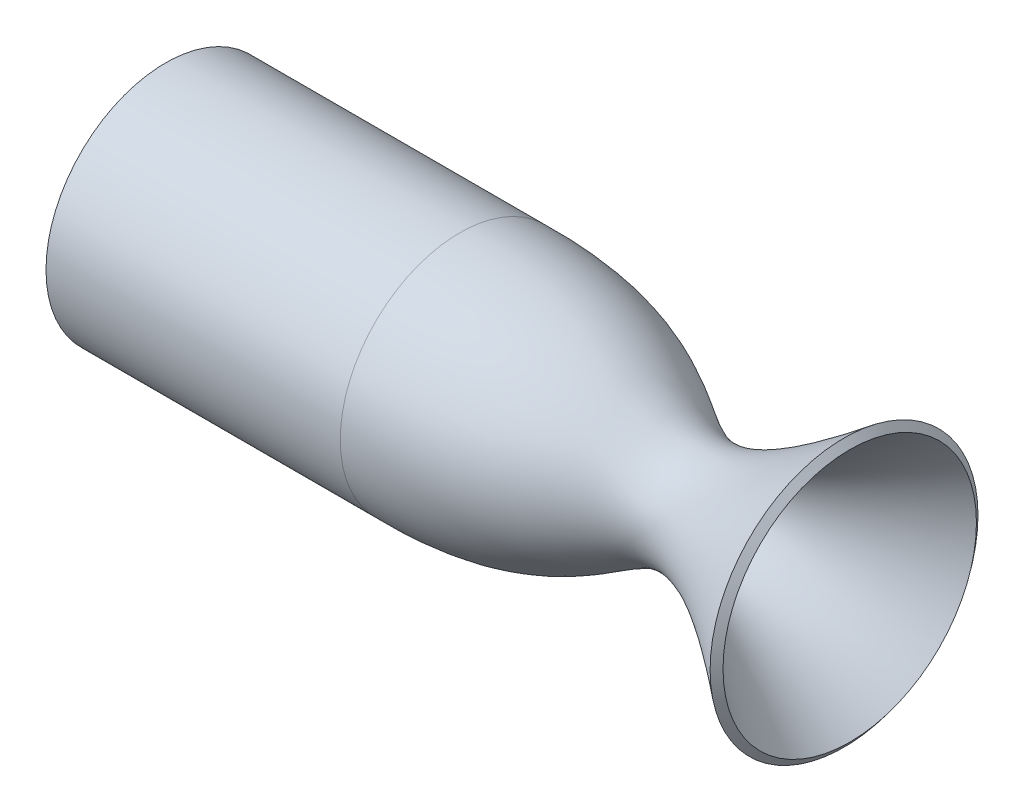
ISO-10303-21;
HEADER;
FILE_DESCRIPTION(('STEP AP214'),'2;1');
FILE_NAME('part.step','',(''),(''),'','','');
FILE_SCHEMA(('AUTOMOTIVE_DESIGN { 1 0 10303 214 1 1 1 1 }'));
ENDSEC;
DATA;
#1=APPLICATION_CONTEXT('core data for automotive mechanical design processes');
#2=APPLICATION_PROTOCOL_DEFINITION('international standard','automotive_design',2000,#1);
#3=PRODUCT_CONTEXT('',#1,'mechanical');
#4=PRODUCT('Part','Part','',(#3));
#5=PRODUCT_RELATED_PRODUCT_CATEGORY('part','',(#4));
#6=PRODUCT_DEFINITION_FORMATION('','',#4);
#7=PRODUCT_DEFINITION_CONTEXT('part definition',#1,'design');
#8=PRODUCT_DEFINITION('design','',#6,#7);
#9=PRODUCT_DEFINITION_SHAPE('','',#8);
#10=(LENGTH_UNIT() NAMED_UNIT(*) SI_UNIT(.MILLI.,.METRE.));
#11=(NAMED_UNIT(*) PLANE_ANGLE_UNIT() SI_UNIT($,.RADIAN.));
#12=(NAMED_UNIT(*) SI_UNIT($,.STERADIAN.) SOLID_ANGLE_UNIT());
#13=UNCERTAINTY_MEASURE_WITH_UNIT(LENGTH_MEASURE(1.E-05),#10,'distance_accuracy_value','');
#14=(GEOMETRIC_REPRESENTATION_CONTEXT(3) GLOBAL_UNCERTAINTY_ASSIGNED_CONTEXT((#13)) GLOBAL_UNIT_ASSIGNED_CONTEXT((#10,
#11,#12)) REPRESENTATION_CONTEXT('',''));
#15=CARTESIAN_POINT('',(0.,0.,0.));
#16=DIRECTION('',(0.,0.,1.));
#17=DIRECTION('',(1.,0.,0.));
#18=AXIS2_PLACEMENT_3D('',#15,#16,#17);
#19=CARTESIAN_POINT('',(19.9542238614139,0.,0.));
#20=DIRECTION('',(-1.,0.,0.));
#21=DIRECTION('',(0.,0.,1.));
#22=AXIS2_PLACEMENT_3D('',#19,#20,#21);
#23=TOROIDAL_SURFACE('',#22,65.,5.);
#24=CARTESIAN_POINT('',(20.0453943145529,0.,0.));
#25=DIRECTION('',(-1.,0.,0.));
#26=DIRECTION('',(0.,0.,1.));
#27=AXIS2_PLACEMENT_3D('',#24,#25,#26);
#28=CIRCLE('',#27,60.0008312742542);
#29=CARTESIAN_POINT('',(20.0453943145529,0.,60.0008312742542));
#30=VERTEX_POINT('',#29);
#31=EDGE_CURVE('E10',#30,#30,#28,.T.);
#32=ORIENTED_EDGE('',*,*,#31,.F.);
#33=EDGE_LOOP('',(#32));
#34=FACE_BOUND('',#33,.T.);
#35=CARTESIAN_POINT('',(19.9542238614141,0.,0.));
#36=DIRECTION('',(-1.,0.,0.));
#37=DIRECTION('',(0.,0.,1.));
#38=AXIS2_PLACEMENT_3D('',#35,#36,#37);
#39=CIRCLE('',#38,60.);
#40=CARTESIAN_POINT('',(19.9542238614141,0.,60.));
#41=VERTEX_POINT('',#40);
#42=EDGE_CURVE('E74',#41,#41,#39,.T.);
#43=ORIENTED_EDGE('',*,*,#42,.T.);
#44=EDGE_LOOP('',(#43));
#45=FACE_BOUND('',#44,.T.);
#46=ADVANCED_FACE('F43',(#34,#45),#23,.T.);
#47=CARTESIAN_POINT('',(20.0453943145529,60.0008312742542,0.));
#48=CARTESIAN_POINT('',(155.133832213171,62.4644556831841,0.));
#49=CARTESIAN_POINT('',(107.158700851325,-29.0920130598655,0.));
#50=CARTESIAN_POINT('',(231.918980433363,68.8810681869095,0.));
#51=B_SPLINE_CURVE_WITH_KNOTS('',3,(#47,#48,#49,#50),.UNSPECIFIED.,.F.,.F.,(4,4),
(0.000111981809478533,1.),.UNSPECIFIED.);
#52=CARTESIAN_POINT('',(-140.,0.,0.));
#53=DIRECTION('',(-1.,0.,0.));
#54=AXIS1_PLACEMENT('',#52,#53);
#55=SURFACE_OF_REVOLUTION('',#51,#54);
#56=CARTESIAN_POINT('',(231.918980433363,0.,0.));
#57=DIRECTION('',(-1.,0.,0.));
#58=DIRECTION('',(0.,0.,1.));
#59=AXIS2_PLACEMENT_3D('',#56,#57,#58);
#60=CIRCLE('',#59,68.8810681869094);
#61=CARTESIAN_POINT('',(231.918980433363,0.,68.8810681869094));
#62=VERTEX_POINT('',#61);
#63=EDGE_CURVE('E50',#62,#62,#60,.T.);
#64=ORIENTED_EDGE('',*,*,#63,.F.);
#65=EDGE_LOOP('',(#64));
#66=FACE_BOUND('',#65,.T.);
#67=ORIENTED_EDGE('',*,*,#31,.T.);
#68=EDGE_LOOP('',(#67));
#69=FACE_BOUND('',#68,.T.);
#70=ADVANCED_FACE('F98',(#66,#69),#55,.T.);
#71=CARTESIAN_POINT('',(231.918980433363,0.,0.));
#72=DIRECTION('',(-1.,0.,0.));
#73=DIRECTION('',(0.,0.,1.));
#74=AXIS2_PLACEMENT_3D('',#71,#72,#73);
#75=CONICAL_SURFACE('',#74,68.8810681869094,0.905089074830135);
#76=CARTESIAN_POINT('',(228.830902799383,0.,0.));
#77=DIRECTION('',(-1.,0.,0.));
#78=DIRECTION('',(0.,0.,1.));
#79=AXIS2_PLACEMENT_3D('',#76,#77,#78);
#80=CIRCLE('',#79,72.8134690472636);
#81=CARTESIAN_POINT('',(228.830902799383,0.,72.8134690472636));
#82=VERTEX_POINT('',#81);
#83=EDGE_CURVE('E55',#82,#82,#80,.T.);
#84=ORIENTED_EDGE('',*,*,#83,.F.);
#85=EDGE_LOOP('',(#84));
#86=FACE_BOUND('',#85,.T.);
#87=ORIENTED_EDGE('',*,*,#63,.T.);
#88=EDGE_LOOP('',(#87));
#89=FACE_BOUND('',#88,.T.);
#90=ADVANCED_FACE('F94',(#86,#89),#75,.T.);
#91=CARTESIAN_POINT('',(228.830902799383,72.8134690472636,0.));
#92=CARTESIAN_POINT('',(227.873902955871,72.0619460165706,0.));
#93=CARTESIAN_POINT('',(225.939095654517,70.5491004777115,0.));
#94=CARTESIAN_POINT('',(222.197887983465,67.6503692128234,0.));
#95=CARTESIAN_POINT('',(217.661687494431,64.1860418612178,0.));
#96=CARTESIAN_POINT('',(212.465840749461,60.3012488115079,0.));
#97=CARTESIAN_POINT('',(205.847141633516,55.4677629589344,0.));
#98=CARTESIAN_POINT('',(198.139536322643,50.0633466133318,0.));
#99=CARTESIAN_POINT('',(189.735067247821,44.5462970966665,0.));
#100=CARTESIAN_POINT('',(182.118464779327,39.9470202209857,0.));
#101=CARTESIAN_POINT('',(172.93972338995,34.9683205754196,0.));
#102=CARTESIAN_POINT('',(163.163761496589,30.7745246728193,0.));
#103=CARTESIAN_POINT('',(153.724403184714,28.4981649420861,0.));
#104=CARTESIAN_POINT('',(146.009326462277,28.3695304728647,0.));
#105=CARTESIAN_POINT('',(139.118198637567,29.8870385990849,0.));
#106=CARTESIAN_POINT('',(132.197152427464,32.8764485246943,0.));
#107=CARTESIAN_POINT('',(124.736044428081,37.1417108736545,0.));
#108=CARTESIAN_POINT('',(116.322752818072,42.2985398118603,0.));
#109=CARTESIAN_POINT('',(106.518267242856,47.8745093104498,0.));
#110=CARTESIAN_POINT('',(94.8674351670282,53.3737675170409,0.));
#111=CARTESIAN_POINT('',(83.2428728955218,57.4887738140017,0.));
#112=CARTESIAN_POINT('',(72.5670177560986,60.2739039273974,0.));
#113=CARTESIAN_POINT('',(63.8138834843757,62.056181027935,0.));
#114=CARTESIAN_POINT('',(54.2550950352868,63.4797754981469,0.));
#115=CARTESIAN_POINT('',(45.5676883570651,64.3248669900122,0.));
#116=CARTESIAN_POINT('',(38.1528644958856,64.7710987316141,0.));
#117=CARTESIAN_POINT('',(32.3531988705481,64.9846501738801,0.));
#118=CARTESIAN_POINT('',(27.3085515009321,65.0563674343271,0.));
#119=CARTESIAN_POINT('',(23.1557541423441,65.047133931167,0.));
#120=CARTESIAN_POINT('',(21.0160369487163,65.0193644154918,0.));
#121=CARTESIAN_POINT('',(19.9542238614135,65.,0.));
#122=B_SPLINE_CURVE_WITH_KNOTS('',3,(#91,#92,#93,#94,#95,#96,#97,#98,#99,#100,#101,#102,#103,
#104,#105,#106,#107,#108,#109,#110,#111,#112,#113,#114,#115,#116,#117,#118,#119,#120,#121),
.UNSPECIFIED.,.F.,.F.,(4,1,1,1,1,1,1,1,1,1,1,1,1,1,1,1,1,1,1,1,1,1,1,1,1,1,1,1,4),
(0.000111981809478533,0.00792360695159195,0.0157352320937054,0.0313584823779323,
0.0469817326621593,0.0626049829463861,0.0938514835148399,0.125097984083294,0.156344484651747,
0.187590985220201,0.250083986357109,0.312576987494016,0.375069988630924,0.437562989767832,
0.500055990904739,0.562548992041647,0.625041993178554,0.687534994315462,0.75002799545237,
0.812520996589277,0.843767497157731,0.875013997726185,0.906260498294639,0.937506998863092,
0.953130249147319,0.968753499431546,0.984376749715773,0.992188374857887,1.),.UNSPECIFIED.);
#123=CARTESIAN_POINT('',(-140.,0.,0.));
#124=DIRECTION('',(-1.,0.,0.));
#125=AXIS1_PLACEMENT('',#123,#124);
#126=SURFACE_OF_REVOLUTION('',#122,#125);
#127=CARTESIAN_POINT('',(19.9542238614141,0.,0.));
#128=DIRECTION('',(-1.,0.,0.));
#129=DIRECTION('',(0.,0.,1.));
#130=AXIS2_PLACEMENT_3D('',#127,#128,#129);
#131=CIRCLE('',#130,65.);
#132=CARTESIAN_POINT('',(19.9542238614141,0.,65.));
#133=VERTEX_POINT('',#132);
#134=EDGE_CURVE('E60',#133,#133,#131,.T.);
#135=ORIENTED_EDGE('',*,*,#134,.F.);
#136=EDGE_LOOP('',(#135));
#137=FACE_BOUND('',#136,.T.);
#138=ORIENTED_EDGE('',*,*,#83,.T.);
#139=EDGE_LOOP('',(#138));
#140=FACE_BOUND('',#139,.T.);
#141=ADVANCED_FACE('F89',(#137,#140),#126,.T.);
#142=CARTESIAN_POINT('',(-140.,0.,0.));
#143=DIRECTION('',(-1.,0.,0.));
#144=DIRECTION('',(0.,0.,1.));
#145=AXIS2_PLACEMENT_3D('',#142,#143,#144);
#146=CYLINDRICAL_SURFACE('',#145,65.);
#147=CARTESIAN_POINT('',(-140.,0.,0.));
#148=DIRECTION('',(-1.,0.,0.));
#149=DIRECTION('',(0.,0.,1.));
#150=AXIS2_PLACEMENT_3D('',#147,#148,#149);
#151=CIRCLE('',#150,65.);
#152=CARTESIAN_POINT('',(-140.,0.,65.));
#153=VERTEX_POINT('',#152);
#154=EDGE_CURVE('E66',#153,#153,#151,.T.);
#155=ORIENTED_EDGE('',*,*,#154,.F.);
#156=EDGE_LOOP('',(#155));
#157=FACE_BOUND('',#156,.T.);
#158=ORIENTED_EDGE('',*,*,#134,.T.);
#159=EDGE_LOOP('',(#158));
#160=FACE_BOUND('',#159,.T.);
#161=ADVANCED_FACE('F93',(#157,#160),#146,.T.);
#162=CARTESIAN_POINT('',(-140.,65.,0.));
#163=DIRECTION('',(1.,0.,0.));
#164=DIRECTION('',(0.,0.,-1.));
#165=AXIS2_PLACEMENT_3D('',#162,#163,#164);
#166=PLANE('',#165);
#167=CARTESIAN_POINT('',(-140.,0.,0.));
#168=DIRECTION('',(-1.,0.,0.));
#169=DIRECTION('',(0.,0.,1.));
#170=AXIS2_PLACEMENT_3D('',#167,#168,#169);
#171=CIRCLE('',#170,60.);
#172=CARTESIAN_POINT('',(-140.,0.,60.));
#173=VERTEX_POINT('',#172);
#174=EDGE_CURVE('E70',#173,#173,#171,.T.);
#175=ORIENTED_EDGE('',*,*,#174,.F.);
#176=EDGE_LOOP('',(#175));
#177=FACE_BOUND('',#176,.T.);
#178=ORIENTED_EDGE('',*,*,#154,.T.);
#179=EDGE_LOOP('',(#178));
#180=FACE_BOUND('',#179,.T.);
#181=ADVANCED_FACE('F114',(#177,#180),#166,.F.);
#182=CARTESIAN_POINT('',(-140.,0.,0.));
#183=DIRECTION('',(-1.,0.,0.));
#184=DIRECTION('',(0.,0.,1.));
#185=AXIS2_PLACEMENT_3D('',#182,#183,#184);
#186=CYLINDRICAL_SURFACE('',#185,60.);
#187=ORIENTED_EDGE('',*,*,#42,.F.);
#188=EDGE_LOOP('',(#187));
#189=FACE_BOUND('',#188,.T.);
#190=ORIENTED_EDGE('',*,*,#174,.T.);
#191=EDGE_LOOP('',(#190));
#192=FACE_BOUND('',#191,.T.);
#193=ADVANCED_FACE('F111',(#189,#192),#186,.F.);
#194=CLOSED_SHELL('',(#46,#70,#90,#141,#161,#181,#193));
#195=MANIFOLD_SOLID_BREP('B2',#194);
#196=ADVANCED_BREP_SHAPE_REPRESENTATION('',(#18,#195),#14);
#197=SHAPE_DEFINITION_REPRESENTATION(#9,#196);
ENDSEC;
END-ISO-10303-21;
